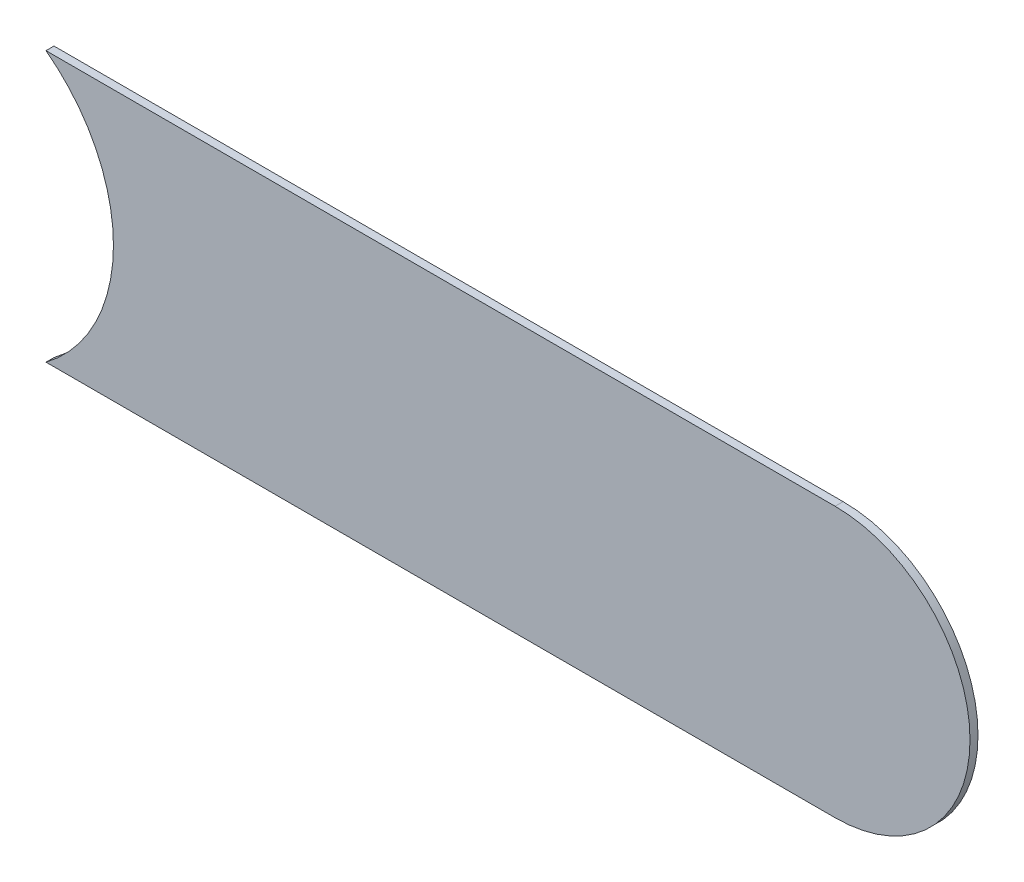
ISO-10303-21;
HEADER;
FILE_DESCRIPTION(('STEP AP214'),'2;1');
FILE_NAME('part.step','',(''),(''),'','','');
FILE_SCHEMA(('AUTOMOTIVE_DESIGN { 1 0 10303 214 1 1 1 1 }'));
ENDSEC;
DATA;
#1=APPLICATION_CONTEXT('core data for automotive mechanical design processes');
#2=APPLICATION_PROTOCOL_DEFINITION('international standard','automotive_design',2000,#1);
#3=PRODUCT_CONTEXT('',#1,'mechanical');
#4=PRODUCT('Part','Part','',(#3));
#5=PRODUCT_RELATED_PRODUCT_CATEGORY('part','',(#4));
#6=PRODUCT_DEFINITION_FORMATION('','',#4);
#7=PRODUCT_DEFINITION_CONTEXT('part definition',#1,'design');
#8=PRODUCT_DEFINITION('design','',#6,#7);
#9=PRODUCT_DEFINITION_SHAPE('','',#8);
#10=(LENGTH_UNIT() NAMED_UNIT(*) SI_UNIT(.MILLI.,.METRE.));
#11=(NAMED_UNIT(*) PLANE_ANGLE_UNIT() SI_UNIT($,.RADIAN.));
#12=(NAMED_UNIT(*) SI_UNIT($,.STERADIAN.) SOLID_ANGLE_UNIT());
#13=UNCERTAINTY_MEASURE_WITH_UNIT(LENGTH_MEASURE(1.E-05),#10,'distance_accuracy_value','');
#14=(GEOMETRIC_REPRESENTATION_CONTEXT(3) GLOBAL_UNCERTAINTY_ASSIGNED_CONTEXT((#13)) GLOBAL_UNIT_ASSIGNED_CONTEXT((#10,
#11,#12)) REPRESENTATION_CONTEXT('',''));
#15=CARTESIAN_POINT('',(0.,0.,0.));
#16=DIRECTION('',(0.,0.,1.));
#17=DIRECTION('',(1.,0.,0.));
#18=AXIS2_PLACEMENT_3D('',#15,#16,#17);
#19=CARTESIAN_POINT('',(101.9300095,41.8999924,0.));
#20=DIRECTION('',(0.,1.,0.));
#21=DIRECTION('',(1.,0.,0.));
#22=AXIS2_PLACEMENT_3D('',#19,#20,#21);
#23=PLANE('',#22);
#24=DIRECTION('',(1.,0.,0.));
#25=VECTOR('',#24,1.);
#26=CARTESIAN_POINT('',(101.4800104,41.8999924,0.03556));
#27=LINE('',#26,#25);
#28=CARTESIAN_POINT('',(101.9300095,41.8999924,0.03556));
#29=VERTEX_POINT('',#28);
#30=CARTESIAN_POINT('',(105.439972,41.8999924,0.03556));
#31=VERTEX_POINT('',#30);
#32=EDGE_CURVE('E11',#29,#31,#27,.T.);
#33=ORIENTED_EDGE('',*,*,#32,.F.);
#34=DIRECTION('',(0.,0.,1.));
#35=VECTOR('',#34,1.);
#36=CARTESIAN_POINT('',(101.9300095,41.8999924,0.));
#37=LINE('',#36,#35);
#38=CARTESIAN_POINT('',(101.9300095,41.8999924,0.));
#39=VERTEX_POINT('',#38);
#40=EDGE_CURVE('E24',#39,#29,#37,.T.);
#41=ORIENTED_EDGE('',*,*,#40,.F.);
#42=DIRECTION('',(1.,0.,0.));
#43=VECTOR('',#42,1.);
#44=CARTESIAN_POINT('',(101.4800104,41.8999924,0.));
#45=LINE('',#44,#43);
#46=CARTESIAN_POINT('',(105.439972,41.8999924,0.));
#47=VERTEX_POINT('',#46);
#48=EDGE_CURVE('E82',#39,#47,#45,.T.);
#49=ORIENTED_EDGE('',*,*,#48,.T.);
#50=DIRECTION('',(0.,0.,1.));
#51=VECTOR('',#50,1.);
#52=CARTESIAN_POINT('',(105.439972,41.8999924,0.));
#53=LINE('',#52,#51);
#54=EDGE_CURVE('E37',#47,#31,#53,.T.);
#55=ORIENTED_EDGE('',*,*,#54,.T.);
#56=EDGE_LOOP('',(#33,#41,#49,#55));
#57=FACE_BOUND('',#56,.T.);
#58=ADVANCED_FACE('F17',(#57),#23,.F.);
#59=CARTESIAN_POINT('',(105.439972,42.4999912,0.));
#60=DIRECTION('',(0.,0.,-1.));
#61=DIRECTION('',(0.,-1.,0.));
#62=AXIS2_PLACEMENT_3D('',#59,#60,#61);
#63=CYLINDRICAL_SURFACE('',#62,0.599998799999997);
#64=CARTESIAN_POINT('',(105.439972,42.4999912,0.03556));
#65=DIRECTION('',(0.,0.,1.));
#66=DIRECTION('',(0.,-1.,0.));
#67=AXIS2_PLACEMENT_3D('',#64,#65,#66);
#68=CIRCLE('',#67,0.599998799999997);
#69=CARTESIAN_POINT('',(105.439972,43.09999,0.03556));
#70=VERTEX_POINT('',#69);
#71=EDGE_CURVE('E97',#31,#70,#68,.T.);
#72=ORIENTED_EDGE('',*,*,#71,.F.);
#73=ORIENTED_EDGE('',*,*,#54,.F.);
#74=CARTESIAN_POINT('',(105.439972,42.4999912,0.));
#75=DIRECTION('',(0.,0.,1.));
#76=DIRECTION('',(0.,-1.,0.));
#77=AXIS2_PLACEMENT_3D('',#74,#75,#76);
#78=CIRCLE('',#77,0.599998799999997);
#79=CARTESIAN_POINT('',(105.439972,43.09999,0.));
#80=VERTEX_POINT('',#79);
#81=EDGE_CURVE('E94',#47,#80,#78,.T.);
#82=ORIENTED_EDGE('',*,*,#81,.T.);
#83=DIRECTION('',(0.,0.,1.));
#84=VECTOR('',#83,1.);
#85=CARTESIAN_POINT('',(105.439972,43.09999,0.));
#86=LINE('',#85,#84);
#87=EDGE_CURVE('E92',#80,#70,#86,.T.);
#88=ORIENTED_EDGE('',*,*,#87,.T.);
#89=EDGE_LOOP('',(#72,#73,#82,#88));
#90=FACE_BOUND('',#89,.T.);
#91=ADVANCED_FACE('F103',(#90),#63,.T.);
#92=CARTESIAN_POINT('',(105.439972,43.09999,0.));
#93=DIRECTION('',(0.,-1.,0.));
#94=DIRECTION('',(-1.,0.,0.));
#95=AXIS2_PLACEMENT_3D('',#92,#93,#94);
#96=PLANE('',#95);
#97=DIRECTION('',(-1.,0.,0.));
#98=VECTOR('',#97,1.);
#99=CARTESIAN_POINT('',(105.439972,43.09999,0.03556));
#100=LINE('',#99,#98);
#101=CARTESIAN_POINT('',(101.9300095,43.09999,0.03556));
#102=VERTEX_POINT('',#101);
#103=EDGE_CURVE('E89',#70,#102,#100,.T.);
#104=ORIENTED_EDGE('',*,*,#103,.F.);
#105=ORIENTED_EDGE('',*,*,#87,.F.);
#106=DIRECTION('',(-1.,0.,0.));
#107=VECTOR('',#106,1.);
#108=CARTESIAN_POINT('',(105.439972,43.09999,0.));
#109=LINE('',#108,#107);
#110=CARTESIAN_POINT('',(101.9300095,43.09999,0.));
#111=VERTEX_POINT('',#110);
#112=EDGE_CURVE('E87',#80,#111,#109,.T.);
#113=ORIENTED_EDGE('',*,*,#112,.T.);
#114=DIRECTION('',(0.,0.,1.));
#115=VECTOR('',#114,1.);
#116=CARTESIAN_POINT('',(101.9300095,43.09999,0.));
#117=LINE('',#116,#115);
#118=EDGE_CURVE('E69',#111,#102,#117,.T.);
#119=ORIENTED_EDGE('',*,*,#118,.T.);
#120=EDGE_LOOP('',(#104,#105,#113,#119));
#121=FACE_BOUND('',#120,.T.);
#122=ADVANCED_FACE('F108',(#121),#96,.F.);
#123=CARTESIAN_POINT('',(101.4800104,42.4999912,0.));
#124=DIRECTION('',(0.,0.,-1.));
#125=DIRECTION('',(1.,0.,0.));
#126=AXIS2_PLACEMENT_3D('',#123,#124,#125);
#127=CYLINDRICAL_SURFACE('',#126,0.7499985);
#128=DIRECTION('',(0.,0.,1.));
#129=VECTOR('',#128,1.);
#130=CARTESIAN_POINT('',(102.2300089,42.4999912,0.));
#131=LINE('',#130,#129);
#132=CARTESIAN_POINT('',(102.2300089,42.4999912,0.));
#133=VERTEX_POINT('',#132);
#134=CARTESIAN_POINT('',(102.2300089,42.4999912,0.03556));
#135=VERTEX_POINT('',#134);
#136=EDGE_CURVE('E59',#133,#135,#131,.T.);
#137=ORIENTED_EDGE('',*,*,#136,.T.);
#138=CARTESIAN_POINT('',(101.4800104,42.4999912,0.03556));
#139=DIRECTION('',(0.,0.,1.));
#140=DIRECTION('',(1.,0.,0.));
#141=AXIS2_PLACEMENT_3D('',#138,#139,#140);
#142=CIRCLE('',#141,0.7499985);
#143=EDGE_CURVE('E70',#135,#102,#142,.T.);
#144=ORIENTED_EDGE('',*,*,#143,.T.);
#145=ORIENTED_EDGE('',*,*,#118,.F.);
#146=CARTESIAN_POINT('',(101.4800104,42.4999912,0.));
#147=DIRECTION('',(0.,0.,1.));
#148=DIRECTION('',(1.,0.,0.));
#149=AXIS2_PLACEMENT_3D('',#146,#147,#148);
#150=CIRCLE('',#149,0.7499985);
#151=EDGE_CURVE('E73',#133,#111,#150,.T.);
#152=ORIENTED_EDGE('',*,*,#151,.F.);
#153=EDGE_LOOP('',(#137,#144,#145,#152));
#154=FACE_BOUND('',#153,.T.);
#155=ADVANCED_FACE('F74',(#154),#127,.F.);
#156=CARTESIAN_POINT('',(101.4800104,42.4999912,0.));
#157=DIRECTION('',(0.,0.,-1.));
#158=DIRECTION('',(1.,0.,0.));
#159=AXIS2_PLACEMENT_3D('',#156,#157,#158);
#160=CYLINDRICAL_SURFACE('',#159,0.7499985);
#161=ORIENTED_EDGE('',*,*,#40,.T.);
#162=CARTESIAN_POINT('',(101.4800104,42.4999912,0.03556));
#163=DIRECTION('',(0.,0.,1.));
#164=DIRECTION('',(1.,0.,0.));
#165=AXIS2_PLACEMENT_3D('',#162,#163,#164);
#166=CIRCLE('',#165,0.7499985);
#167=EDGE_CURVE('E65',#29,#135,#166,.T.);
#168=ORIENTED_EDGE('',*,*,#167,.T.);
#169=ORIENTED_EDGE('',*,*,#136,.F.);
#170=EDGE_CURVE('E63',#39,#133,#150,.T.);
#171=ORIENTED_EDGE('',*,*,#170,.F.);
#172=EDGE_LOOP('',(#161,#168,#169,#171));
#173=FACE_BOUND('',#172,.T.);
#174=ADVANCED_FACE('F61',(#173),#160,.F.);
#175=CARTESIAN_POINT('',(101.4800104,41.8999924,0.));
#176=DIRECTION('',(0.,0.,-1.));
#177=DIRECTION('',(-1.,0.,0.));
#178=AXIS2_PLACEMENT_3D('',#175,#176,#177);
#179=PLANE('',#178);
#180=ORIENTED_EDGE('',*,*,#48,.F.);
#181=ORIENTED_EDGE('',*,*,#170,.T.);
#182=ORIENTED_EDGE('',*,*,#151,.T.);
#183=ORIENTED_EDGE('',*,*,#112,.F.);
#184=ORIENTED_EDGE('',*,*,#81,.F.);
#185=EDGE_LOOP('',(#180,#181,#182,#183,#184));
#186=FACE_BOUND('',#185,.T.);
#187=ADVANCED_FACE('F80',(#186),#179,.T.);
#188=CARTESIAN_POINT('',(101.4800104,41.8999924,0.03556));
#189=DIRECTION('',(0.,0.,-1.));
#190=DIRECTION('',(-1.,0.,0.));
#191=AXIS2_PLACEMENT_3D('',#188,#189,#190);
#192=PLANE('',#191);
#193=ORIENTED_EDGE('',*,*,#167,.F.);
#194=ORIENTED_EDGE('',*,*,#32,.T.);
#195=ORIENTED_EDGE('',*,*,#71,.T.);
#196=ORIENTED_EDGE('',*,*,#103,.T.);
#197=ORIENTED_EDGE('',*,*,#143,.F.);
#198=EDGE_LOOP('',(#193,#194,#195,#196,#197));
#199=FACE_BOUND('',#198,.T.);
#200=ADVANCED_FACE('F106',(#199),#192,.F.);
#201=CLOSED_SHELL('',(#58,#91,#122,#155,#174,#187,#200));
#202=MANIFOLD_SOLID_BREP('B1',#201);
#203=ADVANCED_BREP_SHAPE_REPRESENTATION('',(#18,#202),#14);
#204=SHAPE_DEFINITION_REPRESENTATION(#9,#203);
ENDSEC;
END-ISO-10303-21;
